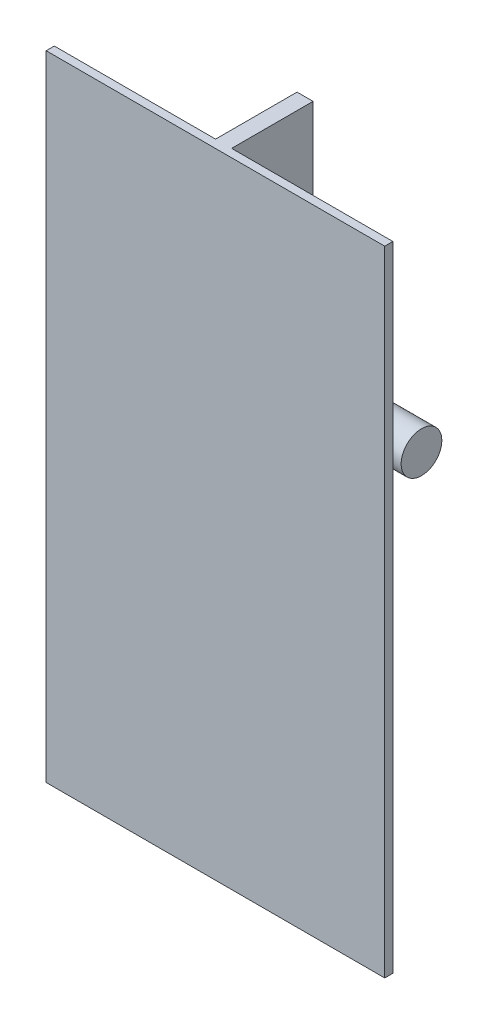
ISO-10303-21;
HEADER;
FILE_DESCRIPTION(('STEP AP214'),'2;1');
FILE_NAME('part.step','',(''),(''),'','','');
FILE_SCHEMA(('AUTOMOTIVE_DESIGN { 1 0 10303 214 1 1 1 1 }'));
ENDSEC;
DATA;
#1=APPLICATION_CONTEXT('core data for automotive mechanical design processes');
#2=APPLICATION_PROTOCOL_DEFINITION('international standard','automotive_design',2000,#1);
#3=PRODUCT_CONTEXT('',#1,'mechanical');
#4=PRODUCT('Part','Part','',(#3));
#5=PRODUCT_RELATED_PRODUCT_CATEGORY('part','',(#4));
#6=PRODUCT_DEFINITION_FORMATION('','',#4);
#7=PRODUCT_DEFINITION_CONTEXT('part definition',#1,'design');
#8=PRODUCT_DEFINITION('design','',#6,#7);
#9=PRODUCT_DEFINITION_SHAPE('','',#8);
#10=(LENGTH_UNIT() NAMED_UNIT(*) SI_UNIT(.MILLI.,.METRE.));
#11=(NAMED_UNIT(*) PLANE_ANGLE_UNIT() SI_UNIT($,.RADIAN.));
#12=(NAMED_UNIT(*) SI_UNIT($,.STERADIAN.) SOLID_ANGLE_UNIT());
#13=UNCERTAINTY_MEASURE_WITH_UNIT(LENGTH_MEASURE(1.E-05),#10,'distance_accuracy_value','');
#14=(GEOMETRIC_REPRESENTATION_CONTEXT(3) GLOBAL_UNCERTAINTY_ASSIGNED_CONTEXT((#13)) GLOBAL_UNIT_ASSIGNED_CONTEXT((#10,
#11,#12)) REPRESENTATION_CONTEXT('',''));
#15=CARTESIAN_POINT('',(0.,0.,0.));
#16=DIRECTION('',(0.,0.,1.));
#17=DIRECTION('',(1.,0.,0.));
#18=AXIS2_PLACEMENT_3D('',#15,#16,#17);
#19=CARTESIAN_POINT('',(-55.,-90.7578098422164,-26.7091070809329));
#20=DIRECTION('',(1.,0.,0.));
#21=DIRECTION('',(0.,0.,-1.));
#22=AXIS2_PLACEMENT_3D('',#19,#20,#21);
#23=CYLINDRICAL_SURFACE('',#22,12.7);
#24=CARTESIAN_POINT('',(-55.,-90.7578098422164,-26.7091070809329));
#25=DIRECTION('',(-1.,0.,0.));
#26=DIRECTION('',(0.,0.,1.));
#27=AXIS2_PLACEMENT_3D('',#24,#25,#26);
#28=CIRCLE('',#27,12.7);
#29=CARTESIAN_POINT('',(-55.,-90.7578098422164,-14.0091070809329));
#30=VERTEX_POINT('',#29);
#31=EDGE_CURVE('E12',#30,#30,#28,.T.);
#32=ORIENTED_EDGE('',*,*,#31,.F.);
#33=EDGE_LOOP('',(#32));
#34=FACE_BOUND('',#33,.T.);
#35=CARTESIAN_POINT('',(-5.,-90.7578098422164,-26.7091070809329));
#36=DIRECTION('',(-1.,0.,0.));
#37=DIRECTION('',(0.,0.,1.));
#38=AXIS2_PLACEMENT_3D('',#35,#36,#37);
#39=CIRCLE('',#38,12.7);
#40=CARTESIAN_POINT('',(-5.,-90.7578098422164,-14.0091070809329));
#41=VERTEX_POINT('',#40);
#42=EDGE_CURVE('E67',#41,#41,#39,.T.);
#43=ORIENTED_EDGE('',*,*,#42,.T.);
#44=EDGE_LOOP('',(#43));
#45=FACE_BOUND('',#44,.T.);
#46=ADVANCED_FACE('F64',(#34,#45),#23,.T.);
#47=CARTESIAN_POINT('',(-55.,-90.7578098422164,-26.7091070809329));
#48=DIRECTION('',(-1.,0.,0.));
#49=DIRECTION('',(0.,0.,1.));
#50=AXIS2_PLACEMENT_3D('',#47,#48,#49);
#51=PLANE('',#50);
#52=ORIENTED_EDGE('',*,*,#31,.T.);
#53=EDGE_LOOP('',(#52));
#54=FACE_BOUND('',#53,.T.);
#55=ADVANCED_FACE('F79',(#54),#51,.T.);
#56=CARTESIAN_POINT('',(-5.,-90.7578098422164,-26.7091070809329));
#57=DIRECTION('',(-1.,0.,0.));
#58=DIRECTION('',(0.,0.,1.));
#59=AXIS2_PLACEMENT_3D('',#56,#57,#58);
#60=PLANE('',#59);
#61=ORIENTED_EDGE('',*,*,#42,.F.);
#62=EDGE_LOOP('',(#61));
#63=FACE_BOUND('',#62,.T.);
#64=ADVANCED_FACE('F77',(#63),#60,.F.);
#65=CLOSED_SHELL('',(#46,#55,#64));
#66=MANIFOLD_SOLID_BREP('B2',#65);
#67=CARTESIAN_POINT('',(55.,-90.7578098422164,-26.7091070809329));
#68=DIRECTION('',(-1.,0.,0.));
#69=DIRECTION('',(0.,0.,1.));
#70=AXIS2_PLACEMENT_3D('',#67,#68,#69);
#71=CYLINDRICAL_SURFACE('',#70,12.7);
#72=CARTESIAN_POINT('',(55.,-90.7578098422164,-26.7091070809329));
#73=DIRECTION('',(1.,0.,0.));
#74=DIRECTION('',(0.,0.,-1.));
#75=AXIS2_PLACEMENT_3D('',#72,#73,#74);
#76=CIRCLE('',#75,12.7);
#77=CARTESIAN_POINT('',(55.,-90.7578098422164,-39.4091070809329));
#78=VERTEX_POINT('',#77);
#79=EDGE_CURVE('E63',#78,#78,#76,.T.);
#80=ORIENTED_EDGE('',*,*,#79,.F.);
#81=EDGE_LOOP('',(#80));
#82=FACE_BOUND('',#81,.T.);
#83=CARTESIAN_POINT('',(5.,-90.7578098422164,-26.7091070809329));
#84=DIRECTION('',(1.,0.,0.));
#85=DIRECTION('',(0.,0.,-1.));
#86=AXIS2_PLACEMENT_3D('',#83,#84,#85);
#87=CIRCLE('',#86,12.7);
#88=CARTESIAN_POINT('',(5.,-90.7578098422164,-39.4091070809329));
#89=VERTEX_POINT('',#88);
#90=EDGE_CURVE('E116',#89,#89,#87,.T.);
#91=ORIENTED_EDGE('',*,*,#90,.T.);
#92=EDGE_LOOP('',(#91));
#93=FACE_BOUND('',#92,.T.);
#94=ADVANCED_FACE('F113',(#82,#93),#71,.T.);
#95=CARTESIAN_POINT('',(55.,-90.7578098422164,-26.7091070809329));
#96=DIRECTION('',(1.,0.,0.));
#97=DIRECTION('',(0.,0.,-1.));
#98=AXIS2_PLACEMENT_3D('',#95,#96,#97);
#99=PLANE('',#98);
#100=ORIENTED_EDGE('',*,*,#79,.T.);
#101=EDGE_LOOP('',(#100));
#102=FACE_BOUND('',#101,.T.);
#103=ADVANCED_FACE('F128',(#102),#99,.T.);
#104=CARTESIAN_POINT('',(5.,-90.7578098422164,-26.7091070809329));
#105=DIRECTION('',(1.,0.,0.));
#106=DIRECTION('',(0.,0.,-1.));
#107=AXIS2_PLACEMENT_3D('',#104,#105,#106);
#108=PLANE('',#107);
#109=ORIENTED_EDGE('',*,*,#90,.F.);
#110=EDGE_LOOP('',(#109));
#111=FACE_BOUND('',#110,.T.);
#112=ADVANCED_FACE('F126',(#111),#108,.F.);
#113=CLOSED_SHELL('',(#94,#103,#112));
#114=MANIFOLD_SOLID_BREP('B7',#113);
#115=CARTESIAN_POINT('',(53.5073522296898,18.9630163630028,-69.9048211552764));
#116=DIRECTION('',(-1.,0.,0.));
#117=DIRECTION('',(0.,0.,1.));
#118=AXIS2_PLACEMENT_3D('',#115,#116,#117);
#119=CYLINDRICAL_SURFACE('',#118,12.7);
#120=CARTESIAN_POINT('',(53.5073522296898,18.9630163630028,-69.9048211552764));
#121=DIRECTION('',(1.,0.,0.));
#122=DIRECTION('',(0.,0.,-1.));
#123=AXIS2_PLACEMENT_3D('',#120,#121,#122);
#124=CIRCLE('',#123,12.7);
#125=CARTESIAN_POINT('',(53.5073522296898,18.9630163630028,-82.6048211552764));
#126=VERTEX_POINT('',#125);
#127=EDGE_CURVE('E112',#126,#126,#124,.T.);
#128=ORIENTED_EDGE('',*,*,#127,.F.);
#129=EDGE_LOOP('',(#128));
#130=FACE_BOUND('',#129,.T.);
#131=CARTESIAN_POINT('',(3.50735222968978,18.9630163630028,-69.9048211552764));
#132=DIRECTION('',(1.,0.,0.));
#133=DIRECTION('',(0.,0.,-1.));
#134=AXIS2_PLACEMENT_3D('',#131,#132,#133);
#135=CIRCLE('',#134,12.7);
#136=CARTESIAN_POINT('',(3.50735222968978,18.9630163630028,-82.6048211552764));
#137=VERTEX_POINT('',#136);
#138=EDGE_CURVE('E166',#137,#137,#135,.T.);
#139=ORIENTED_EDGE('',*,*,#138,.T.);
#140=EDGE_LOOP('',(#139));
#141=FACE_BOUND('',#140,.T.);
#142=ADVANCED_FACE('F163',(#130,#141),#119,.T.);
#143=CARTESIAN_POINT('',(53.5073522296898,18.9630163630028,-69.9048211552764));
#144=DIRECTION('',(1.,0.,0.));
#145=DIRECTION('',(0.,0.,-1.));
#146=AXIS2_PLACEMENT_3D('',#143,#144,#145);
#147=PLANE('',#146);
#148=ORIENTED_EDGE('',*,*,#127,.T.);
#149=EDGE_LOOP('',(#148));
#150=FACE_BOUND('',#149,.T.);
#151=ADVANCED_FACE('F178',(#150),#147,.T.);
#152=CARTESIAN_POINT('',(3.50735222968978,18.9630163630028,-69.9048211552764));
#153=DIRECTION('',(1.,0.,0.));
#154=DIRECTION('',(0.,0.,-1.));
#155=AXIS2_PLACEMENT_3D('',#152,#153,#154);
#156=PLANE('',#155);
#157=ORIENTED_EDGE('',*,*,#138,.F.);
#158=EDGE_LOOP('',(#157));
#159=FACE_BOUND('',#158,.T.);
#160=ADVANCED_FACE('F176',(#159),#156,.F.);
#161=CLOSED_SHELL('',(#142,#151,#160));
#162=MANIFOLD_SOLID_BREP('B58',#161);
#163=CARTESIAN_POINT('',(3.50735222968979,63.9205678035674,-80.8));
#164=DIRECTION('',(-1.,0.,0.));
#165=DIRECTION('',(0.,-1.,0.));
#166=AXIS2_PLACEMENT_3D('',#163,#164,#165);
#167=PLANE('',#166);
#168=DIRECTION('',(0.,0.287073532115298,0.957908548431868));
#169=VECTOR('',#168,1.);
#170=CARTESIAN_POINT('',(3.50735222968978,34.9447736344142,-10.4725233036317));
#171=LINE('',#170,#169);
#172=CARTESIAN_POINT('',(3.50735222968978,13.8684849082793,-80.8));
#173=VERTEX_POINT('',#172);
#174=CARTESIAN_POINT('',(3.50735222968978,22.8591197424266,-50.8));
#175=VERTEX_POINT('',#174);
#176=EDGE_CURVE('E306',#173,#175,#171,.T.);
#177=ORIENTED_EDGE('',*,*,#176,.T.);
#178=DIRECTION('',(0.,-1.,0.));
#179=VECTOR('',#178,1.);
#180=CARTESIAN_POINT('',(3.50735222968979,63.9205678035674,-50.8));
#181=LINE('',#180,#179);
#182=CARTESIAN_POINT('',(3.50735222968977,-36.1835979870087,-50.8));
#183=VERTEX_POINT('',#182);
#184=EDGE_CURVE('E227',#175,#183,#181,.T.);
#185=ORIENTED_EDGE('',*,*,#184,.T.);
#186=DIRECTION('',(0.,0.,1.));
#187=VECTOR('',#186,1.);
#188=CARTESIAN_POINT('',(3.50735222968977,-36.1835979870087,-80.8));
#189=LINE('',#188,#187);
#190=CARTESIAN_POINT('',(3.50735222968978,-36.1835979870087,-65.8));
#191=VERTEX_POINT('',#190);
#192=EDGE_CURVE('E338',#191,#183,#189,.T.);
#193=ORIENTED_EDGE('',*,*,#192,.F.);
#194=DIRECTION('',(0.,0.957908548431867,-0.287073532115298));
#195=VECTOR('',#194,1.);
#196=CARTESIAN_POINT('',(3.50735222968978,-21.0762887261348,-70.3274766963682));
#197=LINE('',#196,#195);
#198=EDGE_CURVE('E328',#191,#173,#197,.T.);
#199=ORIENTED_EDGE('',*,*,#198,.T.);
#200=EDGE_LOOP('',(#177,#185,#193,#199));
#201=FACE_BOUND('',#200,.T.);
#202=ADVANCED_FACE('F204',(#201),#167,.F.);
#203=CARTESIAN_POINT('',(-4.05497067055194,63.9205678035674,-80.8));
#204=DIRECTION('',(1.,0.,0.));
#205=DIRECTION('',(0.,1.,0.));
#206=AXIS2_PLACEMENT_3D('',#203,#204,#205);
#207=PLANE('',#206);
#208=CARTESIAN_POINT('',(-4.05497067055195,15.7465254605142,-69.7441128940284));
#209=DIRECTION('',(-1.,0.,0.));
#210=DIRECTION('',(0.,0.,1.));
#211=AXIS2_PLACEMENT_3D('',#208,#209,#210);
#212=CIRCLE('',#211,12.7);
#213=CARTESIAN_POINT('',(-4.05497067055195,6.69174134909615,-78.6492173120355));
#214=VERTEX_POINT('',#213);
#215=CARTESIAN_POINT('',(-4.05497067055195,20.6879241623283,-58.044857410464));
#216=VERTEX_POINT('',#215);
#217=EDGE_CURVE('E312',#214,#216,#212,.T.);
#218=ORIENTED_EDGE('',*,*,#217,.F.);
#219=DIRECTION('',(0.,0.957908548431867,-0.287073532115298));
#220=VECTOR('',#219,1.);
#221=CARTESIAN_POINT('',(-4.05497067055194,59.7957149469408,-94.5638318073827));
#222=LINE('',#221,#220);
#223=CARTESIAN_POINT('',(-4.05497067055196,-36.1835979870087,-65.8));
#224=VERTEX_POINT('',#223);
#225=EDGE_CURVE('E318',#224,#214,#222,.T.);
#226=ORIENTED_EDGE('',*,*,#225,.F.);
#227=DIRECTION('',(0.,0.,1.));
#228=VECTOR('',#227,1.);
#229=CARTESIAN_POINT('',(-4.05497067055196,-36.1835979870087,-80.8));
#230=LINE('',#229,#228);
#231=CARTESIAN_POINT('',(-4.05497067055196,-36.1835979870087,-50.8));
#232=VERTEX_POINT('',#231);
#233=EDGE_CURVE('E336',#224,#232,#230,.T.);
#234=ORIENTED_EDGE('',*,*,#233,.T.);
#235=DIRECTION('',(0.,1.,0.));
#236=VECTOR('',#235,1.);
#237=CARTESIAN_POINT('',(-4.05497067055194,63.9205678035674,-50.8));
#238=LINE('',#237,#236);
#239=CARTESIAN_POINT('',(-4.05497067055195,22.8591197424266,-50.8));
#240=VERTEX_POINT('',#239);
#241=EDGE_CURVE('E334',#232,#240,#238,.T.);
#242=ORIENTED_EDGE('',*,*,#241,.T.);
#243=DIRECTION('',(0.,0.287073532115298,0.957908548431867));
#244=VECTOR('',#243,1.);
#245=CARTESIAN_POINT('',(-4.05497067055195,17.993337764906,-67.0361681926173));
#246=LINE('',#245,#244);
#247=EDGE_CURVE('E321',#216,#240,#246,.T.);
#248=ORIENTED_EDGE('',*,*,#247,.F.);
#249=EDGE_LOOP('',(#218,#226,#234,#242,#248));
#250=FACE_BOUND('',#249,.T.);
#251=ADVANCED_FACE('F317',(#250),#207,.F.);
#252=CARTESIAN_POINT('',(3.50735222968977,-36.1835979870087,-80.8));
#253=DIRECTION('',(0.,1.,0.));
#254=DIRECTION('',(0.,0.,1.));
#255=AXIS2_PLACEMENT_3D('',#252,#253,#254);
#256=PLANE('',#255);
#257=DIRECTION('',(1.,0.,0.));
#258=VECTOR('',#257,1.);
#259=CARTESIAN_POINT('',(-16.4926477703102,-36.1835979870087,-65.8));
#260=LINE('',#259,#258);
#261=EDGE_CURVE('E324',#224,#191,#260,.T.);
#262=ORIENTED_EDGE('',*,*,#261,.T.);
#263=ORIENTED_EDGE('',*,*,#192,.T.);
#264=DIRECTION('',(-1.,0.,0.));
#265=VECTOR('',#264,1.);
#266=CARTESIAN_POINT('',(3.50735222968977,-36.1835979870087,-50.8));
#267=LINE('',#266,#265);
#268=EDGE_CURVE('E326',#183,#232,#267,.T.);
#269=ORIENTED_EDGE('',*,*,#268,.T.);
#270=ORIENTED_EDGE('',*,*,#233,.F.);
#271=EDGE_LOOP('',(#262,#263,#269,#270));
#272=FACE_BOUND('',#271,.T.);
#273=ADVANCED_FACE('F427',(#272),#256,.F.);
#274=CARTESIAN_POINT('',(0.,0.,-50.8));
#275=DIRECTION('',(0.,0.,1.));
#276=DIRECTION('',(1.,0.,0.));
#277=AXIS2_PLACEMENT_3D('',#274,#275,#276);
#278=PLANE('',#277);
#279=DIRECTION('',(1.,0.,0.));
#280=VECTOR('',#279,1.);
#281=CARTESIAN_POINT('',(-16.4926477703102,22.8591197424266,-50.8));
#282=LINE('',#281,#280);
#283=EDGE_CURVE('E452',#240,#175,#282,.T.);
#284=ORIENTED_EDGE('',*,*,#283,.F.);
#285=ORIENTED_EDGE('',*,*,#241,.F.);
#286=ORIENTED_EDGE('',*,*,#268,.F.);
#287=ORIENTED_EDGE('',*,*,#184,.F.);
#288=EDGE_LOOP('',(#284,#285,#286,#287));
#289=FACE_BOUND('',#288,.T.);
#290=DIRECTION('',(0.,1.,0.));
#291=VECTOR('',#290,1.);
#292=CARTESIAN_POINT('',(-5.,-201.49845045258,-50.8));
#293=LINE('',#292,#291);
#294=CARTESIAN_POINT('',(-5.,-201.49845045258,-50.8));
#295=VERTEX_POINT('',#294);
#296=CARTESIAN_POINT('',(-5.,193.764206015363,-50.8));
#297=VERTEX_POINT('',#296);
#298=EDGE_CURVE('E350',#295,#297,#293,.T.);
#299=ORIENTED_EDGE('',*,*,#298,.T.);
#300=DIRECTION('',(1.,0.,0.));
#301=VECTOR('',#300,1.);
#302=CARTESIAN_POINT('',(5.,193.764206015363,-50.8));
#303=LINE('',#302,#301);
#304=CARTESIAN_POINT('',(5.,193.764206015363,-50.8));
#305=VERTEX_POINT('',#304);
#306=EDGE_CURVE('E352',#297,#305,#303,.T.);
#307=ORIENTED_EDGE('',*,*,#306,.T.);
#308=DIRECTION('',(0.,-1.,0.));
#309=VECTOR('',#308,1.);
#310=CARTESIAN_POINT('',(5.,-201.49845045258,-50.8));
#311=LINE('',#310,#309);
#312=CARTESIAN_POINT('',(5.,-201.49845045258,-50.8));
#313=VERTEX_POINT('',#312);
#314=EDGE_CURVE('E344',#305,#313,#311,.T.);
#315=ORIENTED_EDGE('',*,*,#314,.T.);
#316=DIRECTION('',(-1.,0.,0.));
#317=VECTOR('',#316,1.);
#318=CARTESIAN_POINT('',(5.,-201.49845045258,-50.8));
#319=LINE('',#318,#317);
#320=EDGE_CURVE('E347',#313,#295,#319,.T.);
#321=ORIENTED_EDGE('',*,*,#320,.T.);
#322=EDGE_LOOP('',(#299,#307,#315,#321));
#323=FACE_BOUND('',#322,.T.);
#324=ADVANCED_FACE('F431',(#289,#323),#278,.F.);
#325=CARTESIAN_POINT('',(0.,0.,0.));
#326=DIRECTION('',(0.,0.,-1.));
#327=DIRECTION('',(-1.,0.,0.));
#328=AXIS2_PLACEMENT_3D('',#325,#326,#327);
#329=PLANE('',#328);
#330=DIRECTION('',(0.,-1.,0.));
#331=VECTOR('',#330,1.);
#332=CARTESIAN_POINT('',(5.,-201.49845045258,0.));
#333=LINE('',#332,#331);
#334=CARTESIAN_POINT('',(5.,193.764206015363,0.));
#335=VERTEX_POINT('',#334);
#336=CARTESIAN_POINT('',(5.,-201.49845045258,0.));
#337=VERTEX_POINT('',#336);
#338=EDGE_CURVE('E355',#335,#337,#333,.T.);
#339=ORIENTED_EDGE('',*,*,#338,.F.);
#340=DIRECTION('',(-1.,0.,0.));
#341=VECTOR('',#340,1.);
#342=CARTESIAN_POINT('',(-105.584602078241,193.764206015363,0.));
#343=LINE('',#342,#341);
#344=CARTESIAN_POINT('',(105.580016593533,193.764206015363,0.));
#345=VERTEX_POINT('',#344);
#346=EDGE_CURVE('E376',#345,#335,#343,.T.);
#347=ORIENTED_EDGE('',*,*,#346,.F.);
#348=DIRECTION('',(0.,1.,0.));
#349=VECTOR('',#348,1.);
#350=CARTESIAN_POINT('',(105.580016593533,-201.49845045258,0.));
#351=LINE('',#350,#349);
#352=CARTESIAN_POINT('',(105.580016593533,-201.49845045258,0.));
#353=VERTEX_POINT('',#352);
#354=EDGE_CURVE('E389',#353,#345,#351,.T.);
#355=ORIENTED_EDGE('',*,*,#354,.F.);
#356=DIRECTION('',(1.,0.,0.));
#357=VECTOR('',#356,1.);
#358=CARTESIAN_POINT('',(-105.584602078241,-201.49845045258,0.));
#359=LINE('',#358,#357);
#360=EDGE_CURVE('E385',#337,#353,#359,.T.);
#361=ORIENTED_EDGE('',*,*,#360,.F.);
#362=EDGE_LOOP('',(#339,#347,#355,#361));
#363=FACE_BOUND('',#362,.T.);
#364=ADVANCED_FACE('F461',(#363),#329,.T.);
#365=CARTESIAN_POINT('',(-105.584602078241,-201.49845045258,5.08));
#366=DIRECTION('',(1.,0.,0.));
#367=DIRECTION('',(0.,0.,-1.));
#368=AXIS2_PLACEMENT_3D('',#365,#366,#367);
#369=PLANE('',#368);
#370=DIRECTION('',(0.,-1.,0.));
#371=VECTOR('',#370,1.);
#372=CARTESIAN_POINT('',(-105.584602078241,-201.49845045258,0.));
#373=LINE('',#372,#371);
#374=CARTESIAN_POINT('',(-105.584602078241,193.764206015363,0.));
#375=VERTEX_POINT('',#374);
#376=CARTESIAN_POINT('',(-105.584602078241,-201.49845045258,0.));
#377=VERTEX_POINT('',#376);
#378=EDGE_CURVE('E371',#375,#377,#373,.T.);
#379=ORIENTED_EDGE('',*,*,#378,.T.);
#380=DIRECTION('',(0.,0.,-1.));
#381=VECTOR('',#380,1.);
#382=CARTESIAN_POINT('',(-105.584602078241,-201.49845045258,5.08));
#383=LINE('',#382,#381);
#384=CARTESIAN_POINT('',(-105.584602078241,-201.49845045258,5.08));
#385=VERTEX_POINT('',#384);
#386=EDGE_CURVE('E212',#385,#377,#383,.T.);
#387=ORIENTED_EDGE('',*,*,#386,.F.);
#388=DIRECTION('',(0.,-1.,0.));
#389=VECTOR('',#388,1.);
#390=CARTESIAN_POINT('',(-105.584602078241,-201.49845045258,5.08));
#391=LINE('',#390,#389);
#392=CARTESIAN_POINT('',(-105.584602078241,193.764206015363,5.08));
#393=VERTEX_POINT('',#392);
#394=EDGE_CURVE('E372',#393,#385,#391,.T.);
#395=ORIENTED_EDGE('',*,*,#394,.F.);
#396=DIRECTION('',(0.,0.,-1.));
#397=VECTOR('',#396,1.);
#398=CARTESIAN_POINT('',(-105.584602078241,193.764206015363,5.08));
#399=LINE('',#398,#397);
#400=EDGE_CURVE('E382',#393,#375,#399,.T.);
#401=ORIENTED_EDGE('',*,*,#400,.T.);
#402=EDGE_LOOP('',(#379,#387,#395,#401));
#403=FACE_BOUND('',#402,.T.);
#404=ADVANCED_FACE('F206',(#403),#369,.F.);
#405=CARTESIAN_POINT('',(-105.584602078241,-201.49845045258,5.08));
#406=DIRECTION('',(0.,1.,0.));
#407=DIRECTION('',(0.,0.,1.));
#408=AXIS2_PLACEMENT_3D('',#405,#406,#407);
#409=PLANE('',#408);
#410=CARTESIAN_POINT('',(-5.,-201.49845045258,0.));
#411=VERTEX_POINT('',#410);
#412=EDGE_CURVE('E386',#377,#411,#359,.T.);
#413=ORIENTED_EDGE('',*,*,#412,.T.);
#414=DIRECTION('',(0.,0.,1.));
#415=VECTOR('',#414,1.);
#416=CARTESIAN_POINT('',(-5.,-201.49845045258,-50.8));
#417=LINE('',#416,#415);
#418=EDGE_CURVE('E365',#295,#411,#417,.T.);
#419=ORIENTED_EDGE('',*,*,#418,.F.);
#420=ORIENTED_EDGE('',*,*,#320,.F.);
#421=DIRECTION('',(0.,0.,1.));
#422=VECTOR('',#421,1.);
#423=CARTESIAN_POINT('',(5.,-201.49845045258,-50.8));
#424=LINE('',#423,#422);
#425=EDGE_CURVE('E368',#313,#337,#424,.T.);
#426=ORIENTED_EDGE('',*,*,#425,.T.);
#427=ORIENTED_EDGE('',*,*,#360,.T.);
#428=DIRECTION('',(0.,0.,-1.));
#429=VECTOR('',#428,1.);
#430=CARTESIAN_POINT('',(105.580016593533,-201.49845045258,5.08));
#431=LINE('',#430,#429);
#432=CARTESIAN_POINT('',(105.580016593533,-201.49845045258,5.08));
#433=VERTEX_POINT('',#432);
#434=EDGE_CURVE('E399',#433,#353,#431,.T.);
#435=ORIENTED_EDGE('',*,*,#434,.F.);
#436=DIRECTION('',(1.,0.,0.));
#437=VECTOR('',#436,1.);
#438=CARTESIAN_POINT('',(-105.584602078241,-201.49845045258,5.08));
#439=LINE('',#438,#437);
#440=EDGE_CURVE('E375',#385,#433,#439,.T.);
#441=ORIENTED_EDGE('',*,*,#440,.F.);
#442=ORIENTED_EDGE('',*,*,#386,.T.);
#443=EDGE_LOOP('',(#413,#419,#420,#426,#427,#435,#441,#442));
#444=FACE_BOUND('',#443,.T.);
#445=ADVANCED_FACE('F474',(#444),#409,.F.);
#446=CARTESIAN_POINT('',(105.580016593533,-201.49845045258,5.08));
#447=DIRECTION('',(-1.,0.,0.));
#448=DIRECTION('',(0.,0.,1.));
#449=AXIS2_PLACEMENT_3D('',#446,#447,#448);
#450=PLANE('',#449);
#451=ORIENTED_EDGE('',*,*,#354,.T.);
#452=DIRECTION('',(0.,0.,-1.));
#453=VECTOR('',#452,1.);
#454=CARTESIAN_POINT('',(105.580016593533,193.764206015363,5.08));
#455=LINE('',#454,#453);
#456=CARTESIAN_POINT('',(105.580016593533,193.764206015363,5.08));
#457=VERTEX_POINT('',#456);
#458=EDGE_CURVE('E396',#457,#345,#455,.T.);
#459=ORIENTED_EDGE('',*,*,#458,.F.);
#460=DIRECTION('',(0.,1.,0.));
#461=VECTOR('',#460,1.);
#462=CARTESIAN_POINT('',(105.580016593533,-201.49845045258,5.08));
#463=LINE('',#462,#461);
#464=EDGE_CURVE('E378',#433,#457,#463,.T.);
#465=ORIENTED_EDGE('',*,*,#464,.F.);
#466=ORIENTED_EDGE('',*,*,#434,.T.);
#467=EDGE_LOOP('',(#451,#459,#465,#466));
#468=FACE_BOUND('',#467,.T.);
#469=ADVANCED_FACE('F491',(#468),#450,.F.);
#470=CARTESIAN_POINT('',(-105.584602078241,193.764206015363,5.08));
#471=DIRECTION('',(0.,-1.,0.));
#472=DIRECTION('',(0.,0.,-1.));
#473=AXIS2_PLACEMENT_3D('',#470,#471,#472);
#474=PLANE('',#473);
#475=ORIENTED_EDGE('',*,*,#346,.T.);
#476=DIRECTION('',(0.,0.,1.));
#477=VECTOR('',#476,1.);
#478=CARTESIAN_POINT('',(5.,193.764206015363,-50.8));
#479=LINE('',#478,#477);
#480=EDGE_CURVE('E354',#305,#335,#479,.T.);
#481=ORIENTED_EDGE('',*,*,#480,.F.);
#482=ORIENTED_EDGE('',*,*,#306,.F.);
#483=DIRECTION('',(0.,0.,1.));
#484=VECTOR('',#483,1.);
#485=CARTESIAN_POINT('',(-5.,193.764206015363,-50.8));
#486=LINE('',#485,#484);
#487=CARTESIAN_POINT('',(-5.,193.764206015363,0.));
#488=VERTEX_POINT('',#487);
#489=EDGE_CURVE('E362',#297,#488,#486,.T.);
#490=ORIENTED_EDGE('',*,*,#489,.T.);
#491=EDGE_CURVE('E391',#488,#375,#343,.T.);
#492=ORIENTED_EDGE('',*,*,#491,.T.);
#493=ORIENTED_EDGE('',*,*,#400,.F.);
#494=DIRECTION('',(-1.,0.,0.));
#495=VECTOR('',#494,1.);
#496=CARTESIAN_POINT('',(-105.584602078241,193.764206015363,5.08));
#497=LINE('',#496,#495);
#498=EDGE_CURVE('E380',#457,#393,#497,.T.);
#499=ORIENTED_EDGE('',*,*,#498,.F.);
#500=ORIENTED_EDGE('',*,*,#458,.T.);
#501=EDGE_LOOP('',(#475,#481,#482,#490,#492,#493,#499,#500));
#502=FACE_BOUND('',#501,.T.);
#503=ADVANCED_FACE('F468',(#502),#474,.F.);
#504=CARTESIAN_POINT('',(0.,0.,5.08));
#505=DIRECTION('',(0.,0.,-1.));
#506=DIRECTION('',(-1.,0.,0.));
#507=AXIS2_PLACEMENT_3D('',#504,#505,#506);
#508=PLANE('',#507);
#509=ORIENTED_EDGE('',*,*,#394,.T.);
#510=ORIENTED_EDGE('',*,*,#440,.T.);
#511=ORIENTED_EDGE('',*,*,#464,.T.);
#512=ORIENTED_EDGE('',*,*,#498,.T.);
#513=EDGE_LOOP('',(#509,#510,#511,#512));
#514=FACE_BOUND('',#513,.T.);
#515=ADVANCED_FACE('F485',(#514),#508,.F.);
#516=DIRECTION('',(0.,1.,0.));
#517=VECTOR('',#516,1.);
#518=CARTESIAN_POINT('',(-5.,-201.49845045258,0.));
#519=LINE('',#518,#517);
#520=EDGE_CURVE('E348',#411,#488,#519,.T.);
#521=ORIENTED_EDGE('',*,*,#520,.F.);
#522=ORIENTED_EDGE('',*,*,#412,.F.);
#523=ORIENTED_EDGE('',*,*,#378,.F.);
#524=ORIENTED_EDGE('',*,*,#491,.F.);
#525=EDGE_LOOP('',(#521,#522,#523,#524));
#526=FACE_BOUND('',#525,.T.);
#527=ADVANCED_FACE('F479',(#526),#329,.T.);
#528=CARTESIAN_POINT('',(5.,-201.49845045258,-50.8));
#529=DIRECTION('',(-1.,0.,0.));
#530=DIRECTION('',(0.,-1.,0.));
#531=AXIS2_PLACEMENT_3D('',#528,#529,#530);
#532=PLANE('',#531);
#533=CARTESIAN_POINT('',(5.,-90.7578098422164,-26.7091070809329));
#534=DIRECTION('',(1.,0.,0.));
#535=DIRECTION('',(0.,0.,-1.));
#536=AXIS2_PLACEMENT_3D('',#533,#534,#535);
#537=CIRCLE('',#536,12.7);
#538=CARTESIAN_POINT('',(5.,-90.7578098422164,-39.4091070809329));
#539=VERTEX_POINT('',#538);
#540=EDGE_CURVE('E340',#539,#539,#537,.T.);
#541=ORIENTED_EDGE('',*,*,#540,.F.);
#542=EDGE_LOOP('',(#541));
#543=FACE_BOUND('',#542,.T.);
#544=ORIENTED_EDGE('',*,*,#338,.T.);
#545=ORIENTED_EDGE('',*,*,#425,.F.);
#546=ORIENTED_EDGE('',*,*,#314,.F.);
#547=ORIENTED_EDGE('',*,*,#480,.T.);
#548=EDGE_LOOP('',(#544,#545,#546,#547));
#549=FACE_BOUND('',#548,.T.);
#550=ADVANCED_FACE('F419',(#543,#549),#532,.F.);
#551=CARTESIAN_POINT('',(-5.,-201.49845045258,-50.8));
#552=DIRECTION('',(1.,0.,0.));
#553=DIRECTION('',(0.,0.,-1.));
#554=AXIS2_PLACEMENT_3D('',#551,#552,#553);
#555=PLANE('',#554);
#556=CARTESIAN_POINT('',(-5.,-90.7578098422164,-26.7091070809329));
#557=DIRECTION('',(1.,0.,0.));
#558=DIRECTION('',(0.,0.,-1.));
#559=AXIS2_PLACEMENT_3D('',#556,#557,#558);
#560=CIRCLE('',#559,12.7);
#561=CARTESIAN_POINT('',(-5.,-90.7578098422164,-39.4091070809329));
#562=VERTEX_POINT('',#561);
#563=EDGE_CURVE('E343',#562,#562,#560,.T.);
#564=ORIENTED_EDGE('',*,*,#563,.T.);
#565=EDGE_LOOP('',(#564));
#566=FACE_BOUND('',#565,.T.);
#567=ORIENTED_EDGE('',*,*,#520,.T.);
#568=ORIENTED_EDGE('',*,*,#489,.F.);
#569=ORIENTED_EDGE('',*,*,#298,.F.);
#570=ORIENTED_EDGE('',*,*,#418,.T.);
#571=EDGE_LOOP('',(#567,#568,#569,#570));
#572=FACE_BOUND('',#571,.T.);
#573=ADVANCED_FACE('F406',(#566,#572),#555,.F.);
#574=CARTESIAN_POINT('',(-10.,-90.7578098422164,-26.7091070809329));
#575=DIRECTION('',(1.,0.,0.));
#576=DIRECTION('',(0.,0.,-1.));
#577=AXIS2_PLACEMENT_3D('',#574,#575,#576);
#578=CYLINDRICAL_SURFACE('',#577,12.7);
#579=ORIENTED_EDGE('',*,*,#540,.T.);
#580=EDGE_LOOP('',(#579));
#581=FACE_BOUND('',#580,.T.);
#582=ORIENTED_EDGE('',*,*,#563,.F.);
#583=EDGE_LOOP('',(#582));
#584=FACE_BOUND('',#583,.T.);
#585=ADVANCED_FACE('F409',(#581,#584),#578,.F.);
#586=CARTESIAN_POINT('',(-16.4926477703102,-21.0762887261348,-70.3274766963682));
#587=DIRECTION('',(0.,-0.287073532115298,-0.957908548431867));
#588=DIRECTION('',(0.,0.957908548431867,-0.287073532115298));
#589=AXIS2_PLACEMENT_3D('',#586,#587,#588);
#590=PLANE('',#589);
#591=ORIENTED_EDGE('',*,*,#225,.T.);
#592=DIRECTION('',(0.,0.957908548431867,-0.287073532115298));
#593=VECTOR('',#592,1.);
#594=CARTESIAN_POINT('',(-4.05497067055195,-21.0762887261348,-70.3274766963682));
#595=LINE('',#594,#593);
#596=CARTESIAN_POINT('',(-4.05497067055195,13.8684849082794,-80.8));
#597=VERTEX_POINT('',#596);
#598=EDGE_CURVE('E299',#214,#597,#595,.T.);
#599=ORIENTED_EDGE('',*,*,#598,.T.);
#600=DIRECTION('',(-1.,0.,0.));
#601=VECTOR('',#600,1.);
#602=CARTESIAN_POINT('',(0.,13.8684849082793,-80.8));
#603=LINE('',#602,#601);
#604=EDGE_CURVE('E161',#173,#597,#603,.T.);
#605=ORIENTED_EDGE('',*,*,#604,.F.);
#606=ORIENTED_EDGE('',*,*,#198,.F.);
#607=ORIENTED_EDGE('',*,*,#261,.F.);
#608=EDGE_LOOP('',(#591,#599,#605,#606,#607));
#609=FACE_BOUND('',#608,.T.);
#610=ADVANCED_FACE('F322',(#609),#590,.T.);
#611=CARTESIAN_POINT('',(-16.4926477703102,34.9447736344142,-10.4725233036317));
#612=DIRECTION('',(0.,0.957908548431867,-0.287073532115297));
#613=DIRECTION('',(0.,0.287073532115298,0.957908548431867));
#614=AXIS2_PLACEMENT_3D('',#611,#612,#613);
#615=PLANE('',#614);
#616=EDGE_CURVE('E302',#597,#216,#246,.T.);
#617=ORIENTED_EDGE('',*,*,#616,.T.);
#618=ORIENTED_EDGE('',*,*,#247,.T.);
#619=ORIENTED_EDGE('',*,*,#283,.T.);
#620=ORIENTED_EDGE('',*,*,#176,.F.);
#621=ORIENTED_EDGE('',*,*,#604,.T.);
#622=EDGE_LOOP('',(#617,#618,#619,#620,#621));
#623=FACE_BOUND('',#622,.T.);
#624=ADVANCED_FACE('F417',(#623),#615,.T.);
#625=CARTESIAN_POINT('',(-54.054970670552,15.7465254605142,-69.7441128940284));
#626=DIRECTION('',(1.,0.,0.));
#627=DIRECTION('',(0.,0.,-1.));
#628=AXIS2_PLACEMENT_3D('',#625,#626,#627);
#629=CYLINDRICAL_SURFACE('',#628,12.7);
#630=CARTESIAN_POINT('',(-54.054970670552,15.7465254605142,-69.7441128940284));
#631=DIRECTION('',(-1.,0.,0.));
#632=DIRECTION('',(0.,0.,1.));
#633=AXIS2_PLACEMENT_3D('',#630,#631,#632);
#634=CIRCLE('',#633,12.7);
#635=CARTESIAN_POINT('',(-54.054970670552,15.7465254605142,-57.0441128940284));
#636=VERTEX_POINT('',#635);
#637=EDGE_CURVE('E307',#636,#636,#634,.T.);
#638=ORIENTED_EDGE('',*,*,#637,.F.);
#639=EDGE_LOOP('',(#638));
#640=FACE_BOUND('',#639,.T.);
#641=EDGE_CURVE('E219',#216,#214,#212,.T.);
#642=ORIENTED_EDGE('',*,*,#641,.T.);
#643=ORIENTED_EDGE('',*,*,#217,.T.);
#644=EDGE_LOOP('',(#642,#643));
#645=FACE_BOUND('',#644,.T.);
#646=ADVANCED_FACE('F311',(#640,#645),#629,.T.);
#647=CARTESIAN_POINT('',(-54.054970670552,15.7465254605142,-69.7441128940284));
#648=DIRECTION('',(-1.,0.,0.));
#649=DIRECTION('',(0.,0.,1.));
#650=AXIS2_PLACEMENT_3D('',#647,#648,#649);
#651=PLANE('',#650);
#652=ORIENTED_EDGE('',*,*,#637,.T.);
#653=EDGE_LOOP('',(#652));
#654=FACE_BOUND('',#653,.T.);
#655=ADVANCED_FACE('F439',(#654),#651,.T.);
#656=CARTESIAN_POINT('',(-4.05497067055195,15.7465254605142,-69.7441128940284));
#657=DIRECTION('',(-1.,0.,0.));
#658=DIRECTION('',(0.,0.,1.));
#659=AXIS2_PLACEMENT_3D('',#656,#657,#658);
#660=PLANE('',#659);
#661=ORIENTED_EDGE('',*,*,#598,.F.);
#662=ORIENTED_EDGE('',*,*,#641,.F.);
#663=ORIENTED_EDGE('',*,*,#616,.F.);
#664=EDGE_LOOP('',(#661,#662,#663));
#665=FACE_BOUND('',#664,.T.);
#666=ADVANCED_FACE('F300',(#665),#660,.F.);
#667=CLOSED_SHELL('',(#202,#251,#273,#324,#364,#404,#445,#469,#503,#515,#527,#550,#573,#585,
#610,#624,#646,#655,#666));
#668=MANIFOLD_SOLID_BREP('B107',#667);
#669=ADVANCED_BREP_SHAPE_REPRESENTATION('',(#18,#66,#114,#162,#668),#14);
#670=SHAPE_DEFINITION_REPRESENTATION(#9,#669);
ENDSEC;
END-ISO-10303-21;
